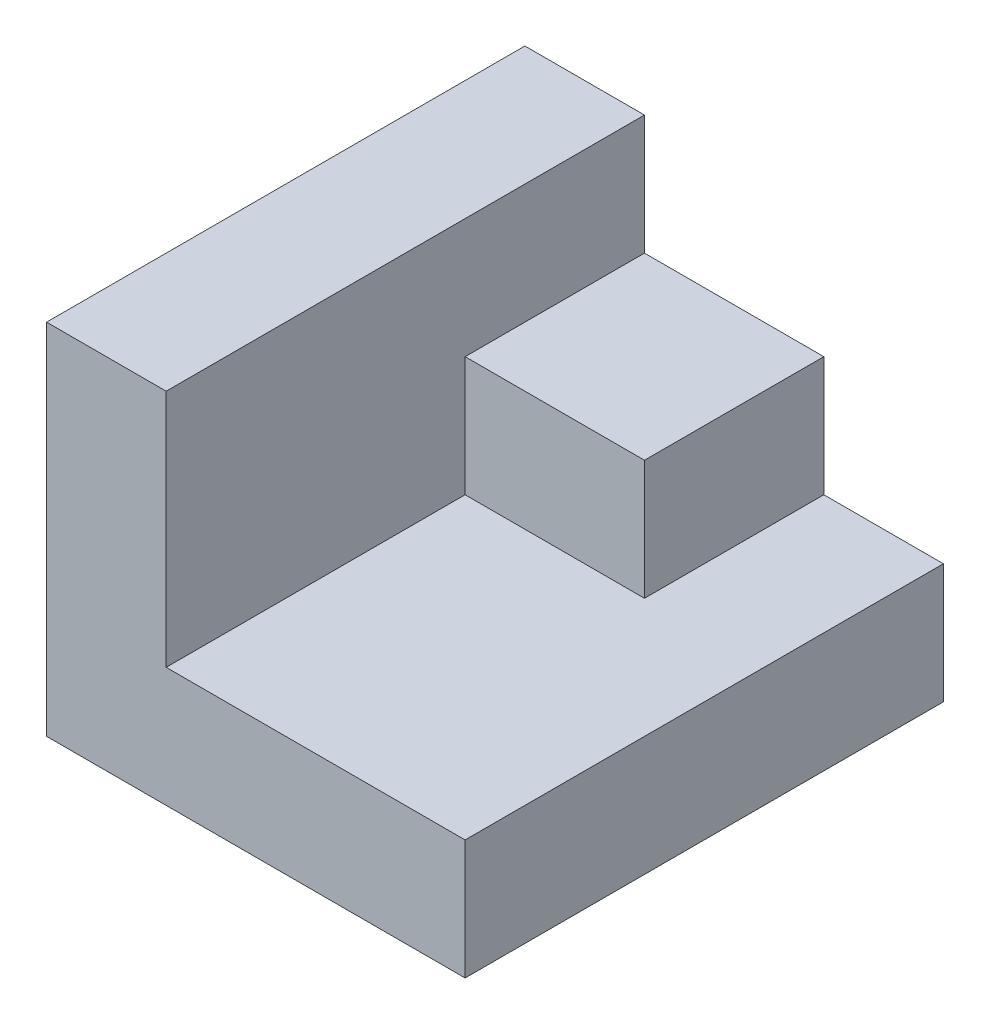
ISO-10303-21;
HEADER;
FILE_DESCRIPTION(('STEP AP214'),'2;1');
FILE_NAME('part.step','',(''),(''),'','','');
FILE_SCHEMA(('AUTOMOTIVE_DESIGN { 1 0 10303 214 1 1 1 1 }'));
ENDSEC;
DATA;
#1=APPLICATION_CONTEXT('core data for automotive mechanical design processes');
#2=APPLICATION_PROTOCOL_DEFINITION('international standard','automotive_design',2000,#1);
#3=PRODUCT_CONTEXT('',#1,'mechanical');
#4=PRODUCT('Part','Part','',(#3));
#5=PRODUCT_RELATED_PRODUCT_CATEGORY('part','',(#4));
#6=PRODUCT_DEFINITION_FORMATION('','',#4);
#7=PRODUCT_DEFINITION_CONTEXT('part definition',#1,'design');
#8=PRODUCT_DEFINITION('design','',#6,#7);
#9=PRODUCT_DEFINITION_SHAPE('','',#8);
#10=(LENGTH_UNIT() NAMED_UNIT(*) SI_UNIT(.MILLI.,.METRE.));
#11=(NAMED_UNIT(*) PLANE_ANGLE_UNIT() SI_UNIT($,.RADIAN.));
#12=(NAMED_UNIT(*) SI_UNIT($,.STERADIAN.) SOLID_ANGLE_UNIT());
#13=UNCERTAINTY_MEASURE_WITH_UNIT(LENGTH_MEASURE(1.E-05),#10,'distance_accuracy_value','');
#14=(GEOMETRIC_REPRESENTATION_CONTEXT(3) GLOBAL_UNCERTAINTY_ASSIGNED_CONTEXT((#13)) GLOBAL_UNIT_ASSIGNED_CONTEXT((#10,
#11,#12)) REPRESENTATION_CONTEXT('',''));
#15=CARTESIAN_POINT('',(0.,0.,0.));
#16=DIRECTION('',(0.,0.,1.));
#17=DIRECTION('',(1.,0.,0.));
#18=AXIS2_PLACEMENT_3D('',#15,#16,#17);
#19=CARTESIAN_POINT('',(10.,30.,-40.));
#20=DIRECTION('',(0.,1.,0.));
#21=DIRECTION('',(0.,0.,1.));
#22=AXIS2_PLACEMENT_3D('',#19,#20,#21);
#23=PLANE('',#22);
#24=DIRECTION('',(-1.,0.,0.));
#25=VECTOR('',#24,1.);
#26=CARTESIAN_POINT('',(10.,30.,0.));
#27=LINE('',#26,#25);
#28=CARTESIAN_POINT('',(10.,30.,0.));
#29=VERTEX_POINT('',#28);
#30=CARTESIAN_POINT('',(0.,30.,0.));
#31=VERTEX_POINT('',#30);
#32=EDGE_CURVE('E131',#29,#31,#27,.T.);
#33=ORIENTED_EDGE('',*,*,#32,.F.);
#34=DIRECTION('',(0.,0.,1.));
#35=VECTOR('',#34,1.);
#36=CARTESIAN_POINT('',(10.,30.,-40.));
#37=LINE('',#36,#35);
#38=CARTESIAN_POINT('',(10.,30.,-40.));
#39=VERTEX_POINT('',#38);
#40=EDGE_CURVE('E11',#39,#29,#37,.T.);
#41=ORIENTED_EDGE('',*,*,#40,.F.);
#42=DIRECTION('',(-1.,0.,0.));
#43=VECTOR('',#42,1.);
#44=CARTESIAN_POINT('',(10.,30.,-40.));
#45=LINE('',#44,#43);
#46=CARTESIAN_POINT('',(0.,30.,-40.));
#47=VERTEX_POINT('',#46);
#48=EDGE_CURVE('E134',#39,#47,#45,.T.);
#49=ORIENTED_EDGE('',*,*,#48,.T.);
#50=DIRECTION('',(0.,0.,1.));
#51=VECTOR('',#50,1.);
#52=CARTESIAN_POINT('',(0.,30.,-40.));
#53=LINE('',#52,#51);
#54=EDGE_CURVE('E36',#47,#31,#53,.T.);
#55=ORIENTED_EDGE('',*,*,#54,.T.);
#56=EDGE_LOOP('',(#33,#41,#49,#55));
#57=FACE_BOUND('',#56,.T.);
#58=ADVANCED_FACE('F33',(#57),#23,.T.);
#59=CARTESIAN_POINT('',(10.,10.,-40.));
#60=DIRECTION('',(1.,0.,0.));
#61=DIRECTION('',(0.,1.,0.));
#62=AXIS2_PLACEMENT_3D('',#59,#60,#61);
#63=PLANE('',#62);
#64=DIRECTION('',(0.,0.,-1.));
#65=VECTOR('',#64,1.);
#66=CARTESIAN_POINT('',(10.,20.,-25.));
#67=LINE('',#66,#65);
#68=CARTESIAN_POINT('',(10.,20.,-25.));
#69=VERTEX_POINT('',#68);
#70=CARTESIAN_POINT('',(10.,20.,-40.));
#71=VERTEX_POINT('',#70);
#72=EDGE_CURVE('E115',#69,#71,#67,.T.);
#73=ORIENTED_EDGE('',*,*,#72,.T.);
#74=DIRECTION('',(0.,1.,0.));
#75=VECTOR('',#74,1.);
#76=CARTESIAN_POINT('',(10.,10.,-40.));
#77=LINE('',#76,#75);
#78=EDGE_CURVE('E149',#71,#39,#77,.T.);
#79=ORIENTED_EDGE('',*,*,#78,.T.);
#80=ORIENTED_EDGE('',*,*,#40,.T.);
#81=DIRECTION('',(0.,1.,0.));
#82=VECTOR('',#81,1.);
#83=CARTESIAN_POINT('',(10.,10.,0.));
#84=LINE('',#83,#82);
#85=CARTESIAN_POINT('',(10.,10.,0.));
#86=VERTEX_POINT('',#85);
#87=EDGE_CURVE('E138',#86,#29,#84,.T.);
#88=ORIENTED_EDGE('',*,*,#87,.F.);
#89=DIRECTION('',(0.,0.,1.));
#90=VECTOR('',#89,1.);
#91=CARTESIAN_POINT('',(10.,10.,-40.));
#92=LINE('',#91,#90);
#93=CARTESIAN_POINT('',(10.,10.,-25.));
#94=VERTEX_POINT('',#93);
#95=EDGE_CURVE('E41',#94,#86,#92,.T.);
#96=ORIENTED_EDGE('',*,*,#95,.F.);
#97=DIRECTION('',(0.,1.,0.));
#98=VECTOR('',#97,1.);
#99=CARTESIAN_POINT('',(10.,10.,-25.));
#100=LINE('',#99,#98);
#101=EDGE_CURVE('E49',#94,#69,#100,.T.);
#102=ORIENTED_EDGE('',*,*,#101,.T.);
#103=EDGE_LOOP('',(#73,#79,#80,#88,#96,#102));
#104=FACE_BOUND('',#103,.T.);
#105=ADVANCED_FACE('F185',(#104),#63,.T.);
#106=CARTESIAN_POINT('',(35.,10.,-40.));
#107=DIRECTION('',(0.,1.,0.));
#108=DIRECTION('',(-1.,0.,0.));
#109=AXIS2_PLACEMENT_3D('',#106,#107,#108);
#110=PLANE('',#109);
#111=DIRECTION('',(0.,0.,-1.));
#112=VECTOR('',#111,1.);
#113=CARTESIAN_POINT('',(25.,9.99999999999999,-25.));
#114=LINE('',#113,#112);
#115=CARTESIAN_POINT('',(25.,10.,-25.));
#116=VERTEX_POINT('',#115);
#117=CARTESIAN_POINT('',(25.,10.,-40.));
#118=VERTEX_POINT('',#117);
#119=EDGE_CURVE('E57',#116,#118,#114,.T.);
#120=ORIENTED_EDGE('',*,*,#119,.F.);
#121=DIRECTION('',(-1.,0.,0.));
#122=VECTOR('',#121,1.);
#123=CARTESIAN_POINT('',(10.,10.,-25.));
#124=LINE('',#123,#122);
#125=EDGE_CURVE('E121',#116,#94,#124,.T.);
#126=ORIENTED_EDGE('',*,*,#125,.T.);
#127=ORIENTED_EDGE('',*,*,#95,.T.);
#128=DIRECTION('',(-1.,0.,0.));
#129=VECTOR('',#128,1.);
#130=CARTESIAN_POINT('',(35.,10.,0.));
#131=LINE('',#130,#129);
#132=CARTESIAN_POINT('',(35.,10.,0.));
#133=VERTEX_POINT('',#132);
#134=EDGE_CURVE('E162',#133,#86,#131,.T.);
#135=ORIENTED_EDGE('',*,*,#134,.F.);
#136=DIRECTION('',(0.,0.,1.));
#137=VECTOR('',#136,1.);
#138=CARTESIAN_POINT('',(35.,10.,-40.));
#139=LINE('',#138,#137);
#140=CARTESIAN_POINT('',(35.,10.,-40.));
#141=VERTEX_POINT('',#140);
#142=EDGE_CURVE('E168',#141,#133,#139,.T.);
#143=ORIENTED_EDGE('',*,*,#142,.F.);
#144=DIRECTION('',(-1.,0.,0.));
#145=VECTOR('',#144,1.);
#146=CARTESIAN_POINT('',(35.,10.,-40.));
#147=LINE('',#146,#145);
#148=EDGE_CURVE('E147',#141,#118,#147,.T.);
#149=ORIENTED_EDGE('',*,*,#148,.T.);
#150=EDGE_LOOP('',(#120,#126,#127,#135,#143,#149));
#151=FACE_BOUND('',#150,.T.);
#152=ADVANCED_FACE('F197',(#151),#110,.T.);
#153=CARTESIAN_POINT('',(35.,0.,-40.));
#154=DIRECTION('',(1.,0.,0.));
#155=DIRECTION('',(0.,0.,-1.));
#156=AXIS2_PLACEMENT_3D('',#153,#154,#155);
#157=PLANE('',#156);
#158=DIRECTION('',(0.,1.,0.));
#159=VECTOR('',#158,1.);
#160=CARTESIAN_POINT('',(35.,0.,0.));
#161=LINE('',#160,#159);
#162=CARTESIAN_POINT('',(35.,0.,0.));
#163=VERTEX_POINT('',#162);
#164=EDGE_CURVE('E159',#163,#133,#161,.T.);
#165=ORIENTED_EDGE('',*,*,#164,.F.);
#166=DIRECTION('',(0.,0.,1.));
#167=VECTOR('',#166,1.);
#168=CARTESIAN_POINT('',(35.,0.,-40.));
#169=LINE('',#168,#167);
#170=CARTESIAN_POINT('',(35.,0.,-40.));
#171=VERTEX_POINT('',#170);
#172=EDGE_CURVE('E170',#171,#163,#169,.T.);
#173=ORIENTED_EDGE('',*,*,#172,.F.);
#174=DIRECTION('',(0.,1.,0.));
#175=VECTOR('',#174,1.);
#176=CARTESIAN_POINT('',(35.,0.,-40.));
#177=LINE('',#176,#175);
#178=EDGE_CURVE('E144',#171,#141,#177,.T.);
#179=ORIENTED_EDGE('',*,*,#178,.T.);
#180=ORIENTED_EDGE('',*,*,#142,.T.);
#181=EDGE_LOOP('',(#165,#173,#179,#180));
#182=FACE_BOUND('',#181,.T.);
#183=ADVANCED_FACE('F196',(#182),#157,.T.);
#184=CARTESIAN_POINT('',(0.,0.,-40.));
#185=DIRECTION('',(0.,-1.,0.));
#186=DIRECTION('',(0.,0.,-1.));
#187=AXIS2_PLACEMENT_3D('',#184,#185,#186);
#188=PLANE('',#187);
#189=DIRECTION('',(1.,0.,0.));
#190=VECTOR('',#189,1.);
#191=CARTESIAN_POINT('',(0.,0.,0.));
#192=LINE('',#191,#190);
#193=CARTESIAN_POINT('',(0.,0.,0.));
#194=VERTEX_POINT('',#193);
#195=EDGE_CURVE('E156',#194,#163,#192,.T.);
#196=ORIENTED_EDGE('',*,*,#195,.F.);
#197=DIRECTION('',(0.,0.,1.));
#198=VECTOR('',#197,1.);
#199=CARTESIAN_POINT('',(0.,0.,-40.));
#200=LINE('',#199,#198);
#201=CARTESIAN_POINT('',(0.,0.,-40.));
#202=VERTEX_POINT('',#201);
#203=EDGE_CURVE('E171',#202,#194,#200,.T.);
#204=ORIENTED_EDGE('',*,*,#203,.F.);
#205=DIRECTION('',(1.,0.,0.));
#206=VECTOR('',#205,1.);
#207=CARTESIAN_POINT('',(0.,0.,-40.));
#208=LINE('',#207,#206);
#209=EDGE_CURVE('E141',#202,#171,#208,.T.);
#210=ORIENTED_EDGE('',*,*,#209,.T.);
#211=ORIENTED_EDGE('',*,*,#172,.T.);
#212=EDGE_LOOP('',(#196,#204,#210,#211));
#213=FACE_BOUND('',#212,.T.);
#214=ADVANCED_FACE('F193',(#213),#188,.T.);
#215=CARTESIAN_POINT('',(0.,30.,-40.));
#216=DIRECTION('',(-1.,0.,0.));
#217=DIRECTION('',(0.,-1.,0.));
#218=AXIS2_PLACEMENT_3D('',#215,#216,#217);
#219=PLANE('',#218);
#220=DIRECTION('',(0.,-1.,0.));
#221=VECTOR('',#220,1.);
#222=CARTESIAN_POINT('',(0.,30.,0.));
#223=LINE('',#222,#221);
#224=EDGE_CURVE('E153',#31,#194,#223,.T.);
#225=ORIENTED_EDGE('',*,*,#224,.F.);
#226=ORIENTED_EDGE('',*,*,#54,.F.);
#227=DIRECTION('',(0.,-1.,0.));
#228=VECTOR('',#227,1.);
#229=CARTESIAN_POINT('',(0.,30.,-40.));
#230=LINE('',#229,#228);
#231=EDGE_CURVE('E137',#47,#202,#230,.T.);
#232=ORIENTED_EDGE('',*,*,#231,.T.);
#233=ORIENTED_EDGE('',*,*,#203,.T.);
#234=EDGE_LOOP('',(#225,#226,#232,#233));
#235=FACE_BOUND('',#234,.T.);
#236=ADVANCED_FACE('F180',(#235),#219,.T.);
#237=CARTESIAN_POINT('',(0.,0.,-40.));
#238=DIRECTION('',(0.,0.,1.));
#239=DIRECTION('',(1.,0.,0.));
#240=AXIS2_PLACEMENT_3D('',#237,#238,#239);
#241=PLANE('',#240);
#242=ORIENTED_EDGE('',*,*,#78,.F.);
#243=DIRECTION('',(1.,0.,0.));
#244=VECTOR('',#243,1.);
#245=CARTESIAN_POINT('',(10.,20.,-40.));
#246=LINE('',#245,#244);
#247=CARTESIAN_POINT('',(25.,20.,-40.));
#248=VERTEX_POINT('',#247);
#249=EDGE_CURVE('E128',#71,#248,#246,.T.);
#250=ORIENTED_EDGE('',*,*,#249,.T.);
#251=DIRECTION('',(0.,-1.,0.));
#252=VECTOR('',#251,1.);
#253=CARTESIAN_POINT('',(25.,9.99999999999999,-40.));
#254=LINE('',#253,#252);
#255=EDGE_CURVE('E110',#248,#118,#254,.T.);
#256=ORIENTED_EDGE('',*,*,#255,.T.);
#257=ORIENTED_EDGE('',*,*,#148,.F.);
#258=ORIENTED_EDGE('',*,*,#178,.F.);
#259=ORIENTED_EDGE('',*,*,#209,.F.);
#260=ORIENTED_EDGE('',*,*,#231,.F.);
#261=ORIENTED_EDGE('',*,*,#48,.F.);
#262=EDGE_LOOP('',(#242,#250,#256,#257,#258,#259,#260,#261));
#263=FACE_BOUND('',#262,.T.);
#264=ADVANCED_FACE('F188',(#263),#241,.F.);
#265=CARTESIAN_POINT('',(0.,0.,0.));
#266=DIRECTION('',(0.,0.,1.));
#267=DIRECTION('',(1.,0.,0.));
#268=AXIS2_PLACEMENT_3D('',#265,#266,#267);
#269=PLANE('',#268);
#270=ORIENTED_EDGE('',*,*,#32,.T.);
#271=ORIENTED_EDGE('',*,*,#224,.T.);
#272=ORIENTED_EDGE('',*,*,#195,.T.);
#273=ORIENTED_EDGE('',*,*,#164,.T.);
#274=ORIENTED_EDGE('',*,*,#134,.T.);
#275=ORIENTED_EDGE('',*,*,#87,.T.);
#276=EDGE_LOOP('',(#270,#271,#272,#273,#274,#275));
#277=FACE_BOUND('',#276,.T.);
#278=ADVANCED_FACE('F182',(#277),#269,.T.);
#279=CARTESIAN_POINT('',(25.,9.99999999999999,-25.));
#280=DIRECTION('',(1.,0.,0.));
#281=DIRECTION('',(0.,0.,-1.));
#282=AXIS2_PLACEMENT_3D('',#279,#280,#281);
#283=PLANE('',#282);
#284=ORIENTED_EDGE('',*,*,#255,.F.);
#285=DIRECTION('',(0.,0.,-1.));
#286=VECTOR('',#285,1.);
#287=CARTESIAN_POINT('',(25.,20.,-25.));
#288=LINE('',#287,#286);
#289=CARTESIAN_POINT('',(25.,20.,-25.));
#290=VERTEX_POINT('',#289);
#291=EDGE_CURVE('E104',#290,#248,#288,.T.);
#292=ORIENTED_EDGE('',*,*,#291,.F.);
#293=DIRECTION('',(0.,-1.,0.));
#294=VECTOR('',#293,1.);
#295=CARTESIAN_POINT('',(25.,9.99999999999999,-25.));
#296=LINE('',#295,#294);
#297=EDGE_CURVE('E107',#290,#116,#296,.T.);
#298=ORIENTED_EDGE('',*,*,#297,.T.);
#299=ORIENTED_EDGE('',*,*,#119,.T.);
#300=EDGE_LOOP('',(#284,#292,#298,#299));
#301=FACE_BOUND('',#300,.T.);
#302=ADVANCED_FACE('F106',(#301),#283,.T.);
#303=CARTESIAN_POINT('',(10.,20.,-25.));
#304=DIRECTION('',(0.,1.,0.));
#305=DIRECTION('',(-1.,0.,0.));
#306=AXIS2_PLACEMENT_3D('',#303,#304,#305);
#307=PLANE('',#306);
#308=ORIENTED_EDGE('',*,*,#249,.F.);
#309=ORIENTED_EDGE('',*,*,#72,.F.);
#310=DIRECTION('',(1.,0.,0.));
#311=VECTOR('',#310,1.);
#312=CARTESIAN_POINT('',(10.,20.,-25.));
#313=LINE('',#312,#311);
#314=EDGE_CURVE('E120',#69,#290,#313,.T.);
#315=ORIENTED_EDGE('',*,*,#314,.T.);
#316=ORIENTED_EDGE('',*,*,#291,.T.);
#317=EDGE_LOOP('',(#308,#309,#315,#316));
#318=FACE_BOUND('',#317,.T.);
#319=ADVANCED_FACE('F123',(#318),#307,.T.);
#320=CARTESIAN_POINT('',(0.,0.,-25.));
#321=DIRECTION('',(0.,0.,-1.));
#322=DIRECTION('',(-1.,0.,0.));
#323=AXIS2_PLACEMENT_3D('',#320,#321,#322);
#324=PLANE('',#323);
#325=ORIENTED_EDGE('',*,*,#101,.F.);
#326=ORIENTED_EDGE('',*,*,#125,.F.);
#327=ORIENTED_EDGE('',*,*,#297,.F.);
#328=ORIENTED_EDGE('',*,*,#314,.F.);
#329=EDGE_LOOP('',(#325,#326,#327,#328));
#330=FACE_BOUND('',#329,.T.);
#331=ADVANCED_FACE('F119',(#330),#324,.F.);
#332=CLOSED_SHELL('',(#58,#105,#152,#183,#214,#236,#264,#278,#302,#319,#331));
#333=MANIFOLD_SOLID_BREP('B2',#332);
#334=ADVANCED_BREP_SHAPE_REPRESENTATION('',(#18,#333),#14);
#335=SHAPE_DEFINITION_REPRESENTATION(#9,#334);
ENDSEC;
END-ISO-10303-21;
